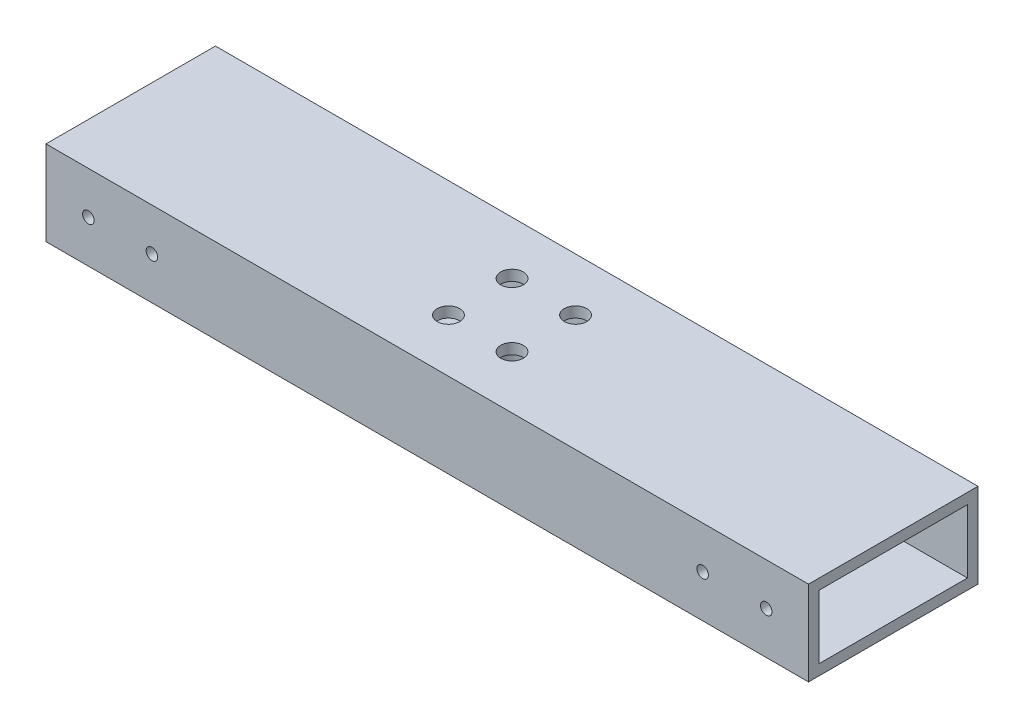
ISO-10303-21;
HEADER;
FILE_DESCRIPTION(('STEP AP214'),'2;1');
FILE_NAME('part.step','',(''),(''),'','','');
FILE_SCHEMA(('AUTOMOTIVE_DESIGN { 1 0 10303 214 1 1 1 1 }'));
ENDSEC;
DATA;
#1=APPLICATION_CONTEXT('core data for automotive mechanical design processes');
#2=APPLICATION_PROTOCOL_DEFINITION('international standard','automotive_design',2000,#1);
#3=PRODUCT_CONTEXT('',#1,'mechanical');
#4=PRODUCT('Part','Part','',(#3));
#5=PRODUCT_RELATED_PRODUCT_CATEGORY('part','',(#4));
#6=PRODUCT_DEFINITION_FORMATION('','',#4);
#7=PRODUCT_DEFINITION_CONTEXT('part definition',#1,'design');
#8=PRODUCT_DEFINITION('design','',#6,#7);
#9=PRODUCT_DEFINITION_SHAPE('','',#8);
#10=(LENGTH_UNIT() NAMED_UNIT(*) SI_UNIT(.MILLI.,.METRE.));
#11=(NAMED_UNIT(*) PLANE_ANGLE_UNIT() SI_UNIT($,.RADIAN.));
#12=(NAMED_UNIT(*) SI_UNIT($,.STERADIAN.) SOLID_ANGLE_UNIT());
#13=UNCERTAINTY_MEASURE_WITH_UNIT(LENGTH_MEASURE(1.E-05),#10,'distance_accuracy_value','');
#14=(GEOMETRIC_REPRESENTATION_CONTEXT(3) GLOBAL_UNCERTAINTY_ASSIGNED_CONTEXT((#13)) GLOBAL_UNIT_ASSIGNED_CONTEXT((#10,
#11,#12)) REPRESENTATION_CONTEXT('',''));
#15=CARTESIAN_POINT('',(0.,0.,0.));
#16=DIRECTION('',(0.,0.,1.));
#17=DIRECTION('',(1.,0.,0.));
#18=AXIS2_PLACEMENT_3D('',#15,#16,#17);
#19=CARTESIAN_POINT('',(114.3,0.,25.4));
#20=DIRECTION('',(0.,-1.,0.));
#21=DIRECTION('',(1.,0.,0.));
#22=AXIS2_PLACEMENT_3D('',#19,#20,#21);
#23=PLANE('',#22);
#24=CARTESIAN_POINT('',(9.525,0.,-9.525));
#25=DIRECTION('',(0.,1.,0.));
#26=DIRECTION('',(0.,0.,1.));
#27=AXIS2_PLACEMENT_3D('',#24,#25,#26);
#28=CIRCLE('',#27,3.37819999999999);
#29=CARTESIAN_POINT('',(9.525,0.,-6.14680000000001));
#30=VERTEX_POINT('',#29);
#31=EDGE_CURVE('E577',#30,#30,#28,.T.);
#32=ORIENTED_EDGE('',*,*,#31,.F.);
#33=EDGE_LOOP('',(#32));
#34=FACE_BOUND('',#33,.T.);
#35=CARTESIAN_POINT('',(9.525,0.,9.525));
#36=DIRECTION('',(0.,1.,0.));
#37=DIRECTION('',(0.,0.,1.));
#38=AXIS2_PLACEMENT_3D('',#35,#36,#37);
#39=CIRCLE('',#38,3.37819999999999);
#40=CARTESIAN_POINT('',(9.525,0.,12.9032));
#41=VERTEX_POINT('',#40);
#42=EDGE_CURVE('E583',#41,#41,#39,.T.);
#43=ORIENTED_EDGE('',*,*,#42,.F.);
#44=EDGE_LOOP('',(#43));
#45=FACE_BOUND('',#44,.T.);
#46=CARTESIAN_POINT('',(-9.525,0.,9.525));
#47=DIRECTION('',(0.,1.,0.));
#48=DIRECTION('',(0.,0.,1.));
#49=AXIS2_PLACEMENT_3D('',#46,#47,#48);
#50=CIRCLE('',#49,3.37819999999999);
#51=CARTESIAN_POINT('',(-9.525,0.,12.9032));
#52=VERTEX_POINT('',#51);
#53=EDGE_CURVE('E588',#52,#52,#50,.T.);
#54=ORIENTED_EDGE('',*,*,#53,.F.);
#55=EDGE_LOOP('',(#54));
#56=FACE_BOUND('',#55,.T.);
#57=DIRECTION('',(-1.,0.,0.));
#58=VECTOR('',#57,1.);
#59=CARTESIAN_POINT('',(114.3,0.,25.4));
#60=LINE('',#59,#58);
#61=CARTESIAN_POINT('',(114.3,0.,25.4));
#62=VERTEX_POINT('',#61);
#63=CARTESIAN_POINT('',(-114.3,0.,25.4));
#64=VERTEX_POINT('',#63);
#65=EDGE_CURVE('E124',#62,#64,#60,.T.);
#66=ORIENTED_EDGE('',*,*,#65,.F.);
#67=DIRECTION('',(0.,0.,-1.));
#68=VECTOR('',#67,1.);
#69=CARTESIAN_POINT('',(114.3,0.,25.4));
#70=LINE('',#69,#68);
#71=CARTESIAN_POINT('',(114.3,0.,-25.4));
#72=VERTEX_POINT('',#71);
#73=EDGE_CURVE('E106',#62,#72,#70,.T.);
#74=ORIENTED_EDGE('',*,*,#73,.T.);
#75=DIRECTION('',(-1.,0.,0.));
#76=VECTOR('',#75,1.);
#77=CARTESIAN_POINT('',(114.3,0.,-25.4));
#78=LINE('',#77,#76);
#79=CARTESIAN_POINT('',(-114.3,0.,-25.4));
#80=VERTEX_POINT('',#79);
#81=EDGE_CURVE('E138',#72,#80,#78,.T.);
#82=ORIENTED_EDGE('',*,*,#81,.T.);
#83=DIRECTION('',(0.,0.,1.));
#84=VECTOR('',#83,1.);
#85=CARTESIAN_POINT('',(-114.3,0.,25.4));
#86=LINE('',#85,#84);
#87=EDGE_CURVE('E118',#80,#64,#86,.T.);
#88=ORIENTED_EDGE('',*,*,#87,.T.);
#89=EDGE_LOOP('',(#66,#74,#82,#88));
#90=FACE_BOUND('',#89,.T.);
#91=CARTESIAN_POINT('',(-9.525,0.,-9.525));
#92=DIRECTION('',(0.,1.,0.));
#93=DIRECTION('',(0.,0.,1.));
#94=AXIS2_PLACEMENT_3D('',#91,#92,#93);
#95=CIRCLE('',#94,3.37819999999999);
#96=CARTESIAN_POINT('',(-9.525,0.,-6.14680000000001));
#97=VERTEX_POINT('',#96);
#98=EDGE_CURVE('E569',#97,#97,#95,.T.);
#99=ORIENTED_EDGE('',*,*,#98,.F.);
#100=EDGE_LOOP('',(#99));
#101=FACE_BOUND('',#100,.T.);
#102=ADVANCED_FACE('F35',(#34,#45,#56,#90,#101),#23,.F.);
#103=CARTESIAN_POINT('',(114.3,23.640442618558,-15.875));
#104=DIRECTION('',(-1.,0.,0.));
#105=DIRECTION('',(0.,-1.,0.));
#106=AXIS2_PLACEMENT_3D('',#103,#104,#105);
#107=PLANE('',#106);
#108=DIRECTION('',(0.,1.,0.));
#109=VECTOR('',#108,1.);
#110=CARTESIAN_POINT('',(114.3,-69.4961266284946,-25.4));
#111=LINE('',#110,#109);
#112=CARTESIAN_POINT('',(114.3,-25.4,-25.4));
#113=VERTEX_POINT('',#112);
#114=EDGE_CURVE('E113',#113,#72,#111,.T.);
#115=ORIENTED_EDGE('',*,*,#114,.T.);
#116=ORIENTED_EDGE('',*,*,#73,.F.);
#117=DIRECTION('',(0.,-1.,0.));
#118=VECTOR('',#117,1.);
#119=CARTESIAN_POINT('',(114.3,-69.4961266284946,25.4));
#120=LINE('',#119,#118);
#121=CARTESIAN_POINT('',(114.3,-25.4,25.4));
#122=VERTEX_POINT('',#121);
#123=EDGE_CURVE('E110',#62,#122,#120,.T.);
#124=ORIENTED_EDGE('',*,*,#123,.T.);
#125=DIRECTION('',(0.,0.,1.));
#126=VECTOR('',#125,1.);
#127=CARTESIAN_POINT('',(114.3,-25.4,25.4));
#128=LINE('',#127,#126);
#129=EDGE_CURVE('E187',#113,#122,#128,.T.);
#130=ORIENTED_EDGE('',*,*,#129,.F.);
#131=EDGE_LOOP('',(#115,#116,#124,#130));
#132=FACE_BOUND('',#131,.T.);
#133=DIRECTION('',(0.,0.,1.));
#134=VECTOR('',#133,1.);
#135=CARTESIAN_POINT('',(114.3,-22.2249999999999,22.225));
#136=LINE('',#135,#134);
#137=CARTESIAN_POINT('',(114.3,-22.2249999999999,-22.225));
#138=VERTEX_POINT('',#137);
#139=CARTESIAN_POINT('',(114.3,-22.2249999999999,22.225));
#140=VERTEX_POINT('',#139);
#141=EDGE_CURVE('E195',#138,#140,#136,.T.);
#142=ORIENTED_EDGE('',*,*,#141,.T.);
#143=DIRECTION('',(0.,-1.,0.));
#144=VECTOR('',#143,1.);
#145=CARTESIAN_POINT('',(114.3,-69.4961266284946,22.225));
#146=LINE('',#145,#144);
#147=CARTESIAN_POINT('',(114.3,-3.1749999999999,22.225));
#148=VERTEX_POINT('',#147);
#149=EDGE_CURVE('E52',#148,#140,#146,.T.);
#150=ORIENTED_EDGE('',*,*,#149,.F.);
#151=DIRECTION('',(0.,0.,-1.));
#152=VECTOR('',#151,1.);
#153=CARTESIAN_POINT('',(114.3,-3.17499999999996,22.225));
#154=LINE('',#153,#152);
#155=CARTESIAN_POINT('',(114.3,-3.1749999999999,-22.225));
#156=VERTEX_POINT('',#155);
#157=EDGE_CURVE('E191',#148,#156,#154,.T.);
#158=ORIENTED_EDGE('',*,*,#157,.T.);
#159=DIRECTION('',(0.,1.,0.));
#160=VECTOR('',#159,1.);
#161=CARTESIAN_POINT('',(114.3,-69.4961266284946,-22.225));
#162=LINE('',#161,#160);
#163=EDGE_CURVE('E184',#138,#156,#162,.T.);
#164=ORIENTED_EDGE('',*,*,#163,.F.);
#165=EDGE_LOOP('',(#142,#150,#158,#164));
#166=FACE_BOUND('',#165,.T.);
#167=ADVANCED_FACE('F108',(#132,#166),#107,.F.);
#168=CARTESIAN_POINT('',(-114.3,0.,5.38726575011048));
#169=DIRECTION('',(1.,0.,0.));
#170=DIRECTION('',(0.,1.,0.));
#171=AXIS2_PLACEMENT_3D('',#168,#169,#170);
#172=PLANE('',#171);
#173=DIRECTION('',(0.,0.,1.));
#174=VECTOR('',#173,1.);
#175=CARTESIAN_POINT('',(-114.3,-3.175,22.225));
#176=LINE('',#175,#174);
#177=CARTESIAN_POINT('',(-114.3,-3.17499999999994,-22.225));
#178=VERTEX_POINT('',#177);
#179=CARTESIAN_POINT('',(-114.3,-3.17499999999994,22.225));
#180=VERTEX_POINT('',#179);
#181=EDGE_CURVE('E194',#178,#180,#176,.T.);
#182=ORIENTED_EDGE('',*,*,#181,.T.);
#183=DIRECTION('',(0.,1.,0.));
#184=VECTOR('',#183,1.);
#185=CARTESIAN_POINT('',(-114.3,-69.4961266284946,22.225));
#186=LINE('',#185,#184);
#187=CARTESIAN_POINT('',(-114.3,-22.225,22.225));
#188=VERTEX_POINT('',#187);
#189=EDGE_CURVE('E182',#188,#180,#186,.T.);
#190=ORIENTED_EDGE('',*,*,#189,.F.);
#191=DIRECTION('',(0.,0.,-1.));
#192=VECTOR('',#191,1.);
#193=CARTESIAN_POINT('',(-114.3,-22.225,22.225));
#194=LINE('',#193,#192);
#195=CARTESIAN_POINT('',(-114.3,-22.225,-22.225));
#196=VERTEX_POINT('',#195);
#197=EDGE_CURVE('E60',#188,#196,#194,.T.);
#198=ORIENTED_EDGE('',*,*,#197,.T.);
#199=DIRECTION('',(0.,-1.,0.));
#200=VECTOR('',#199,1.);
#201=CARTESIAN_POINT('',(-114.3,-69.4961266284946,-22.225));
#202=LINE('',#201,#200);
#203=EDGE_CURVE('E183',#178,#196,#202,.T.);
#204=ORIENTED_EDGE('',*,*,#203,.F.);
#205=EDGE_LOOP('',(#182,#190,#198,#204));
#206=FACE_BOUND('',#205,.T.);
#207=ORIENTED_EDGE('',*,*,#87,.F.);
#208=DIRECTION('',(0.,-1.,0.));
#209=VECTOR('',#208,1.);
#210=CARTESIAN_POINT('',(-114.3,-69.4961266284946,-25.4));
#211=LINE('',#210,#209);
#212=CARTESIAN_POINT('',(-114.3,-25.4,-25.4));
#213=VERTEX_POINT('',#212);
#214=EDGE_CURVE('E190',#80,#213,#211,.T.);
#215=ORIENTED_EDGE('',*,*,#214,.T.);
#216=DIRECTION('',(0.,0.,-1.));
#217=VECTOR('',#216,1.);
#218=CARTESIAN_POINT('',(-114.3,-25.4,25.4));
#219=LINE('',#218,#217);
#220=CARTESIAN_POINT('',(-114.3,-25.4,25.4));
#221=VERTEX_POINT('',#220);
#222=EDGE_CURVE('E186',#221,#213,#219,.T.);
#223=ORIENTED_EDGE('',*,*,#222,.F.);
#224=DIRECTION('',(0.,1.,0.));
#225=VECTOR('',#224,1.);
#226=CARTESIAN_POINT('',(-114.3,-69.4961266284946,25.4));
#227=LINE('',#226,#225);
#228=EDGE_CURVE('E39',#221,#64,#227,.T.);
#229=ORIENTED_EDGE('',*,*,#228,.T.);
#230=EDGE_LOOP('',(#207,#215,#223,#229));
#231=FACE_BOUND('',#230,.T.);
#232=ADVANCED_FACE('F213',(#206,#231),#172,.F.);
#233=CARTESIAN_POINT('',(139.7,-69.4961266284946,-25.4));
#234=DIRECTION('',(0.,0.,-1.));
#235=DIRECTION('',(-1.,0.,0.));
#236=AXIS2_PLACEMENT_3D('',#233,#234,#235);
#237=PLANE('',#236);
#238=ORIENTED_EDGE('',*,*,#114,.F.);
#239=DIRECTION('',(-1.,0.,0.));
#240=VECTOR('',#239,1.);
#241=CARTESIAN_POINT('',(139.7,-25.4,-25.4));
#242=LINE('',#241,#240);
#243=EDGE_CURVE('E135',#113,#213,#242,.T.);
#244=ORIENTED_EDGE('',*,*,#243,.T.);
#245=ORIENTED_EDGE('',*,*,#214,.F.);
#246=ORIENTED_EDGE('',*,*,#81,.F.);
#247=EDGE_LOOP('',(#238,#244,#245,#246));
#248=FACE_BOUND('',#247,.T.);
#249=CARTESIAN_POINT('',(-101.6,-12.7000000000001,-25.4));
#250=DIRECTION('',(0.,0.,1.));
#251=DIRECTION('',(1.,0.,0.));
#252=AXIS2_PLACEMENT_3D('',#249,#250,#251);
#253=CIRCLE('',#252,1.7272);
#254=CARTESIAN_POINT('',(-99.8728,-12.7000000000001,-25.4));
#255=VERTEX_POINT('',#254);
#256=EDGE_CURVE('E167',#255,#255,#253,.T.);
#257=ORIENTED_EDGE('',*,*,#256,.T.);
#258=EDGE_LOOP('',(#257));
#259=FACE_BOUND('',#258,.T.);
#260=CARTESIAN_POINT('',(82.55,-12.7000000000003,-25.4));
#261=DIRECTION('',(0.,0.,1.));
#262=DIRECTION('',(1.,0.,0.));
#263=AXIS2_PLACEMENT_3D('',#260,#261,#262);
#264=CIRCLE('',#263,1.7272);
#265=CARTESIAN_POINT('',(84.2772,-12.7000000000003,-25.4));
#266=VERTEX_POINT('',#265);
#267=EDGE_CURVE('E155',#266,#266,#264,.T.);
#268=ORIENTED_EDGE('',*,*,#267,.T.);
#269=EDGE_LOOP('',(#268));
#270=FACE_BOUND('',#269,.T.);
#271=CARTESIAN_POINT('',(101.6,-12.7000000000001,-25.4));
#272=DIRECTION('',(0.,0.,1.));
#273=DIRECTION('',(1.,0.,0.));
#274=AXIS2_PLACEMENT_3D('',#271,#272,#273);
#275=CIRCLE('',#274,1.7272);
#276=CARTESIAN_POINT('',(103.3272,-12.7000000000001,-25.4));
#277=VERTEX_POINT('',#276);
#278=EDGE_CURVE('E143',#277,#277,#275,.T.);
#279=ORIENTED_EDGE('',*,*,#278,.T.);
#280=EDGE_LOOP('',(#279));
#281=FACE_BOUND('',#280,.T.);
#282=CARTESIAN_POINT('',(-82.55,-12.7000000000003,-25.4));
#283=DIRECTION('',(0.,0.,1.));
#284=DIRECTION('',(1.,0.,0.));
#285=AXIS2_PLACEMENT_3D('',#282,#283,#284);
#286=CIRCLE('',#285,1.7272);
#287=CARTESIAN_POINT('',(-80.8228,-12.7000000000003,-25.4));
#288=VERTEX_POINT('',#287);
#289=EDGE_CURVE('E44',#288,#288,#286,.T.);
#290=ORIENTED_EDGE('',*,*,#289,.T.);
#291=EDGE_LOOP('',(#290));
#292=FACE_BOUND('',#291,.T.);
#293=ADVANCED_FACE('F37',(#248,#259,#270,#281,#292),#237,.T.);
#294=CARTESIAN_POINT('',(139.7,-25.3999999999999,25.4));
#295=DIRECTION('',(0.,1.,0.));
#296=DIRECTION('',(-1.,0.,0.));
#297=AXIS2_PLACEMENT_3D('',#294,#295,#296);
#298=PLANE('',#297);
#299=CARTESIAN_POINT('',(-9.525,-25.4,-9.525));
#300=DIRECTION('',(0.,-1.,0.));
#301=DIRECTION('',(1.,0.,0.));
#302=AXIS2_PLACEMENT_3D('',#299,#300,#301);
#303=CIRCLE('',#302,5.55625);
#304=CARTESIAN_POINT('',(-3.96875,-25.4,-9.525));
#305=VERTEX_POINT('',#304);
#306=EDGE_CURVE('E549',#305,#305,#303,.T.);
#307=ORIENTED_EDGE('',*,*,#306,.F.);
#308=EDGE_LOOP('',(#307));
#309=FACE_BOUND('',#308,.T.);
#310=CARTESIAN_POINT('',(9.52500000000001,-25.4,-9.525));
#311=DIRECTION('',(0.,-1.,0.));
#312=DIRECTION('',(1.,0.,0.));
#313=AXIS2_PLACEMENT_3D('',#310,#311,#312);
#314=CIRCLE('',#313,5.55625);
#315=CARTESIAN_POINT('',(15.08125,-25.4,-9.525));
#316=VERTEX_POINT('',#315);
#317=EDGE_CURVE('E553',#316,#316,#314,.T.);
#318=ORIENTED_EDGE('',*,*,#317,.F.);
#319=EDGE_LOOP('',(#318));
#320=FACE_BOUND('',#319,.T.);
#321=CARTESIAN_POINT('',(9.52500000000001,-25.4,9.525));
#322=DIRECTION('',(0.,-1.,0.));
#323=DIRECTION('',(1.,0.,0.));
#324=AXIS2_PLACEMENT_3D('',#321,#322,#323);
#325=CIRCLE('',#324,5.55625);
#326=CARTESIAN_POINT('',(15.08125,-25.4,9.525));
#327=VERTEX_POINT('',#326);
#328=EDGE_CURVE('E560',#327,#327,#325,.T.);
#329=ORIENTED_EDGE('',*,*,#328,.F.);
#330=EDGE_LOOP('',(#329));
#331=FACE_BOUND('',#330,.T.);
#332=CARTESIAN_POINT('',(-9.525,-25.4,9.525));
#333=DIRECTION('',(0.,-1.,0.));
#334=DIRECTION('',(1.,0.,0.));
#335=AXIS2_PLACEMENT_3D('',#332,#333,#334);
#336=CIRCLE('',#335,5.55625);
#337=CARTESIAN_POINT('',(-3.96875,-25.4,9.525));
#338=VERTEX_POINT('',#337);
#339=EDGE_CURVE('E566',#338,#338,#336,.T.);
#340=ORIENTED_EDGE('',*,*,#339,.F.);
#341=EDGE_LOOP('',(#340));
#342=FACE_BOUND('',#341,.T.);
#343=ORIENTED_EDGE('',*,*,#243,.F.);
#344=ORIENTED_EDGE('',*,*,#129,.T.);
#345=DIRECTION('',(-1.,0.,0.));
#346=VECTOR('',#345,1.);
#347=CARTESIAN_POINT('',(139.7,-25.3999999999999,25.4));
#348=LINE('',#347,#346);
#349=EDGE_CURVE('E126',#122,#221,#348,.T.);
#350=ORIENTED_EDGE('',*,*,#349,.T.);
#351=ORIENTED_EDGE('',*,*,#222,.T.);
#352=EDGE_LOOP('',(#343,#344,#350,#351));
#353=FACE_BOUND('',#352,.T.);
#354=ADVANCED_FACE('F231',(#309,#320,#331,#342,#353),#298,.F.);
#355=CARTESIAN_POINT('',(117.475,-3.17499999999996,22.225));
#356=DIRECTION('',(0.,-1.,0.));
#357=DIRECTION('',(1.,0.,0.));
#358=AXIS2_PLACEMENT_3D('',#355,#356,#357);
#359=PLANE('',#358);
#360=CARTESIAN_POINT('',(-9.525,-3.17499999999998,-9.525));
#361=DIRECTION('',(0.,-1.,0.));
#362=DIRECTION('',(1.,0.,0.));
#363=AXIS2_PLACEMENT_3D('',#360,#361,#362);
#364=CIRCLE('',#363,3.37819999999999);
#365=CARTESIAN_POINT('',(-6.14680000000001,-3.17499999999998,-9.525));
#366=VERTEX_POINT('',#365);
#367=EDGE_CURVE('E574',#366,#366,#364,.T.);
#368=ORIENTED_EDGE('',*,*,#367,.F.);
#369=EDGE_LOOP('',(#368));
#370=FACE_BOUND('',#369,.T.);
#371=CARTESIAN_POINT('',(9.525,-3.17499999999998,-9.525));
#372=DIRECTION('',(0.,-1.,0.));
#373=DIRECTION('',(1.,0.,0.));
#374=AXIS2_PLACEMENT_3D('',#371,#372,#373);
#375=CIRCLE('',#374,3.37819999999999);
#376=CARTESIAN_POINT('',(12.9032,-3.17499999999997,-9.525));
#377=VERTEX_POINT('',#376);
#378=EDGE_CURVE('E580',#377,#377,#375,.T.);
#379=ORIENTED_EDGE('',*,*,#378,.F.);
#380=EDGE_LOOP('',(#379));
#381=FACE_BOUND('',#380,.T.);
#382=CARTESIAN_POINT('',(9.525,-3.17499999999998,9.525));
#383=DIRECTION('',(0.,-1.,0.));
#384=DIRECTION('',(1.,0.,0.));
#385=AXIS2_PLACEMENT_3D('',#382,#383,#384);
#386=CIRCLE('',#385,3.37819999999999);
#387=CARTESIAN_POINT('',(12.9032,-3.17499999999997,9.525));
#388=VERTEX_POINT('',#387);
#389=EDGE_CURVE('E586',#388,#388,#386,.T.);
#390=ORIENTED_EDGE('',*,*,#389,.F.);
#391=EDGE_LOOP('',(#390));
#392=FACE_BOUND('',#391,.T.);
#393=CARTESIAN_POINT('',(-9.525,-3.17499999999998,9.525));
#394=DIRECTION('',(0.,-1.,0.));
#395=DIRECTION('',(1.,0.,0.));
#396=AXIS2_PLACEMENT_3D('',#393,#394,#395);
#397=CIRCLE('',#396,3.37819999999999);
#398=CARTESIAN_POINT('',(-6.14680000000001,-3.17499999999998,9.525));
#399=VERTEX_POINT('',#398);
#400=EDGE_CURVE('E225',#399,#399,#397,.T.);
#401=ORIENTED_EDGE('',*,*,#400,.F.);
#402=EDGE_LOOP('',(#401));
#403=FACE_BOUND('',#402,.T.);
#404=ORIENTED_EDGE('',*,*,#157,.F.);
#405=DIRECTION('',(-1.,0.,0.));
#406=VECTOR('',#405,1.);
#407=CARTESIAN_POINT('',(117.475,-3.1749999999999,22.225));
#408=LINE('',#407,#406);
#409=EDGE_CURVE('E206',#148,#180,#408,.T.);
#410=ORIENTED_EDGE('',*,*,#409,.T.);
#411=ORIENTED_EDGE('',*,*,#181,.F.);
#412=DIRECTION('',(-1.,0.,0.));
#413=VECTOR('',#412,1.);
#414=CARTESIAN_POINT('',(117.475,-3.1749999999999,-22.225));
#415=LINE('',#414,#413);
#416=EDGE_CURVE('E199',#156,#178,#415,.T.);
#417=ORIENTED_EDGE('',*,*,#416,.F.);
#418=EDGE_LOOP('',(#404,#410,#411,#417));
#419=FACE_BOUND('',#418,.T.);
#420=ADVANCED_FACE('F291',(#370,#381,#392,#403,#419),#359,.T.);
#421=CARTESIAN_POINT('',(136.525,-22.2249999999999,22.225));
#422=DIRECTION('',(0.,1.,0.));
#423=DIRECTION('',(-1.,0.,0.));
#424=AXIS2_PLACEMENT_3D('',#421,#422,#423);
#425=PLANE('',#424);
#426=CARTESIAN_POINT('',(-9.525,-22.225,-9.525));
#427=DIRECTION('',(0.,1.,0.));
#428=DIRECTION('',(-1.,0.,0.));
#429=AXIS2_PLACEMENT_3D('',#426,#427,#428);
#430=CIRCLE('',#429,5.55625);
#431=CARTESIAN_POINT('',(-15.08125,-22.225,-9.525));
#432=VERTEX_POINT('',#431);
#433=EDGE_CURVE('E546',#432,#432,#430,.F.);
#434=ORIENTED_EDGE('',*,*,#433,.T.);
#435=EDGE_LOOP('',(#434));
#436=FACE_BOUND('',#435,.T.);
#437=CARTESIAN_POINT('',(9.525,-22.225,-9.525));
#438=DIRECTION('',(0.,1.,0.));
#439=DIRECTION('',(-1.,0.,0.));
#440=AXIS2_PLACEMENT_3D('',#437,#438,#439);
#441=CIRCLE('',#440,5.55625);
#442=CARTESIAN_POINT('',(3.96875,-22.225,-9.525));
#443=VERTEX_POINT('',#442);
#444=EDGE_CURVE('E550',#443,#443,#441,.F.);
#445=ORIENTED_EDGE('',*,*,#444,.T.);
#446=EDGE_LOOP('',(#445));
#447=FACE_BOUND('',#446,.T.);
#448=CARTESIAN_POINT('',(9.525,-22.225,9.525));
#449=DIRECTION('',(0.,1.,0.));
#450=DIRECTION('',(-1.,0.,0.));
#451=AXIS2_PLACEMENT_3D('',#448,#449,#450);
#452=CIRCLE('',#451,5.55625);
#453=CARTESIAN_POINT('',(3.96875,-22.225,9.525));
#454=VERTEX_POINT('',#453);
#455=EDGE_CURVE('E558',#454,#454,#452,.F.);
#456=ORIENTED_EDGE('',*,*,#455,.T.);
#457=EDGE_LOOP('',(#456));
#458=FACE_BOUND('',#457,.T.);
#459=CARTESIAN_POINT('',(-9.525,-22.225,9.525));
#460=DIRECTION('',(0.,1.,0.));
#461=DIRECTION('',(-1.,0.,0.));
#462=AXIS2_PLACEMENT_3D('',#459,#460,#461);
#463=CIRCLE('',#462,5.55625);
#464=CARTESIAN_POINT('',(-15.08125,-22.225,9.525));
#465=VERTEX_POINT('',#464);
#466=EDGE_CURVE('E563',#465,#465,#463,.F.);
#467=ORIENTED_EDGE('',*,*,#466,.T.);
#468=EDGE_LOOP('',(#467));
#469=FACE_BOUND('',#468,.T.);
#470=ORIENTED_EDGE('',*,*,#141,.F.);
#471=DIRECTION('',(-1.,0.,0.));
#472=VECTOR('',#471,1.);
#473=CARTESIAN_POINT('',(136.525,-22.2249999999999,-22.225));
#474=LINE('',#473,#472);
#475=EDGE_CURVE('E202',#138,#196,#474,.T.);
#476=ORIENTED_EDGE('',*,*,#475,.T.);
#477=ORIENTED_EDGE('',*,*,#197,.F.);
#478=DIRECTION('',(-1.,0.,0.));
#479=VECTOR('',#478,1.);
#480=CARTESIAN_POINT('',(136.525,-22.2249999999999,22.225));
#481=LINE('',#480,#479);
#482=EDGE_CURVE('E204',#140,#188,#481,.T.);
#483=ORIENTED_EDGE('',*,*,#482,.F.);
#484=EDGE_LOOP('',(#470,#476,#477,#483));
#485=FACE_BOUND('',#484,.T.);
#486=ADVANCED_FACE('F218',(#436,#447,#458,#469,#485),#425,.T.);
#487=CARTESIAN_POINT('',(136.525,-69.4961266284946,-22.225));
#488=DIRECTION('',(0.,0.,-1.));
#489=DIRECTION('',(-1.,0.,0.));
#490=AXIS2_PLACEMENT_3D('',#487,#488,#489);
#491=PLANE('',#490);
#492=CARTESIAN_POINT('',(-82.55,-12.7000000000003,-22.225));
#493=DIRECTION('',(0.,0.,-1.));
#494=DIRECTION('',(-1.,0.,0.));
#495=AXIS2_PLACEMENT_3D('',#492,#493,#494);
#496=CIRCLE('',#495,1.72719999999999);
#497=CARTESIAN_POINT('',(-84.2772,-12.7000000000003,-22.225));
#498=VERTEX_POINT('',#497);
#499=EDGE_CURVE('E173',#498,#498,#496,.T.);
#500=ORIENTED_EDGE('',*,*,#499,.T.);
#501=EDGE_LOOP('',(#500));
#502=FACE_BOUND('',#501,.T.);
#503=CARTESIAN_POINT('',(-101.6,-12.7000000000001,-22.225));
#504=DIRECTION('',(0.,0.,-1.));
#505=DIRECTION('',(-1.,0.,0.));
#506=AXIS2_PLACEMENT_3D('',#503,#504,#505);
#507=CIRCLE('',#506,1.72719999999999);
#508=CARTESIAN_POINT('',(-103.3272,-12.7000000000001,-22.225));
#509=VERTEX_POINT('',#508);
#510=EDGE_CURVE('E164',#509,#509,#507,.T.);
#511=ORIENTED_EDGE('',*,*,#510,.T.);
#512=EDGE_LOOP('',(#511));
#513=FACE_BOUND('',#512,.T.);
#514=CARTESIAN_POINT('',(82.55,-12.7000000000003,-22.225));
#515=DIRECTION('',(0.,0.,-1.));
#516=DIRECTION('',(-1.,0.,0.));
#517=AXIS2_PLACEMENT_3D('',#514,#515,#516);
#518=CIRCLE('',#517,1.72719999999999);
#519=CARTESIAN_POINT('',(80.8228,-12.7000000000003,-22.225));
#520=VERTEX_POINT('',#519);
#521=EDGE_CURVE('E149',#520,#520,#518,.T.);
#522=ORIENTED_EDGE('',*,*,#521,.T.);
#523=EDGE_LOOP('',(#522));
#524=FACE_BOUND('',#523,.T.);
#525=CARTESIAN_POINT('',(101.6,-12.7000000000001,-22.225));
#526=DIRECTION('',(0.,0.,-1.));
#527=DIRECTION('',(-1.,0.,0.));
#528=AXIS2_PLACEMENT_3D('',#525,#526,#527);
#529=CIRCLE('',#528,1.72719999999999);
#530=CARTESIAN_POINT('',(99.8728,-12.7000000000001,-22.225));
#531=VERTEX_POINT('',#530);
#532=EDGE_CURVE('E130',#531,#531,#529,.T.);
#533=ORIENTED_EDGE('',*,*,#532,.T.);
#534=EDGE_LOOP('',(#533));
#535=FACE_BOUND('',#534,.T.);
#536=ORIENTED_EDGE('',*,*,#475,.F.);
#537=ORIENTED_EDGE('',*,*,#163,.T.);
#538=ORIENTED_EDGE('',*,*,#416,.T.);
#539=ORIENTED_EDGE('',*,*,#203,.T.);
#540=EDGE_LOOP('',(#536,#537,#538,#539));
#541=FACE_BOUND('',#540,.T.);
#542=ADVANCED_FACE('F220',(#502,#513,#524,#535,#541),#491,.F.);
#543=CARTESIAN_POINT('',(136.525,-69.4961266284946,22.225));
#544=DIRECTION('',(0.,0.,1.));
#545=DIRECTION('',(1.,0.,0.));
#546=AXIS2_PLACEMENT_3D('',#543,#544,#545);
#547=PLANE('',#546);
#548=CARTESIAN_POINT('',(-82.55,-12.7000000000003,22.225));
#549=DIRECTION('',(0.,0.,1.));
#550=DIRECTION('',(1.,0.,0.));
#551=AXIS2_PLACEMENT_3D('',#548,#549,#550);
#552=CIRCLE('',#551,1.72719999999999);
#553=CARTESIAN_POINT('',(-80.8228,-12.7000000000003,22.225));
#554=VERTEX_POINT('',#553);
#555=EDGE_CURVE('E176',#554,#554,#552,.T.);
#556=ORIENTED_EDGE('',*,*,#555,.T.);
#557=EDGE_LOOP('',(#556));
#558=FACE_BOUND('',#557,.T.);
#559=CARTESIAN_POINT('',(-101.6,-12.7000000000001,22.225));
#560=DIRECTION('',(0.,0.,1.));
#561=DIRECTION('',(1.,0.,0.));
#562=AXIS2_PLACEMENT_3D('',#559,#560,#561);
#563=CIRCLE('',#562,1.72719999999999);
#564=CARTESIAN_POINT('',(-99.8728,-12.7000000000001,22.225));
#565=VERTEX_POINT('',#564);
#566=EDGE_CURVE('E161',#565,#565,#563,.T.);
#567=ORIENTED_EDGE('',*,*,#566,.T.);
#568=EDGE_LOOP('',(#567));
#569=FACE_BOUND('',#568,.T.);
#570=CARTESIAN_POINT('',(82.55,-12.7000000000003,22.225));
#571=DIRECTION('',(0.,0.,1.));
#572=DIRECTION('',(1.,0.,0.));
#573=AXIS2_PLACEMENT_3D('',#570,#571,#572);
#574=CIRCLE('',#573,1.72719999999999);
#575=CARTESIAN_POINT('',(84.2772,-12.7000000000003,22.225));
#576=VERTEX_POINT('',#575);
#577=EDGE_CURVE('E152',#576,#576,#574,.T.);
#578=ORIENTED_EDGE('',*,*,#577,.T.);
#579=EDGE_LOOP('',(#578));
#580=FACE_BOUND('',#579,.T.);
#581=CARTESIAN_POINT('',(101.6,-12.7000000000001,22.225));
#582=DIRECTION('',(0.,0.,1.));
#583=DIRECTION('',(1.,0.,0.));
#584=AXIS2_PLACEMENT_3D('',#581,#582,#583);
#585=CIRCLE('',#584,1.72719999999999);
#586=CARTESIAN_POINT('',(103.3272,-12.7000000000001,22.225));
#587=VERTEX_POINT('',#586);
#588=EDGE_CURVE('E133',#587,#587,#585,.T.);
#589=ORIENTED_EDGE('',*,*,#588,.T.);
#590=EDGE_LOOP('',(#589));
#591=FACE_BOUND('',#590,.T.);
#592=ORIENTED_EDGE('',*,*,#409,.F.);
#593=ORIENTED_EDGE('',*,*,#149,.T.);
#594=ORIENTED_EDGE('',*,*,#482,.T.);
#595=ORIENTED_EDGE('',*,*,#189,.T.);
#596=EDGE_LOOP('',(#592,#593,#594,#595));
#597=FACE_BOUND('',#596,.T.);
#598=ADVANCED_FACE('F254',(#558,#569,#580,#591,#597),#547,.F.);
#599=CARTESIAN_POINT('',(139.7,-69.4961266284946,25.4));
#600=DIRECTION('',(0.,0.,1.));
#601=DIRECTION('',(1.,0.,0.));
#602=AXIS2_PLACEMENT_3D('',#599,#600,#601);
#603=PLANE('',#602);
#604=ORIENTED_EDGE('',*,*,#123,.F.);
#605=ORIENTED_EDGE('',*,*,#65,.T.);
#606=ORIENTED_EDGE('',*,*,#228,.F.);
#607=ORIENTED_EDGE('',*,*,#349,.F.);
#608=EDGE_LOOP('',(#604,#605,#606,#607));
#609=FACE_BOUND('',#608,.T.);
#610=CARTESIAN_POINT('',(-82.55,-12.7000000000003,25.4));
#611=DIRECTION('',(0.,0.,1.));
#612=DIRECTION('',(1.,0.,0.));
#613=AXIS2_PLACEMENT_3D('',#610,#611,#612);
#614=CIRCLE('',#613,1.72719999999998);
#615=CARTESIAN_POINT('',(-80.8228,-12.7000000000003,25.4));
#616=VERTEX_POINT('',#615);
#617=EDGE_CURVE('E11',#616,#616,#614,.T.);
#618=ORIENTED_EDGE('',*,*,#617,.F.);
#619=EDGE_LOOP('',(#618));
#620=FACE_BOUND('',#619,.T.);
#621=CARTESIAN_POINT('',(-101.6,-12.7000000000001,25.4));
#622=DIRECTION('',(0.,0.,1.));
#623=DIRECTION('',(1.,0.,0.));
#624=AXIS2_PLACEMENT_3D('',#621,#622,#623);
#625=CIRCLE('',#624,1.72719999999998);
#626=CARTESIAN_POINT('',(-99.8728,-12.7000000000001,25.4));
#627=VERTEX_POINT('',#626);
#628=EDGE_CURVE('E170',#627,#627,#625,.T.);
#629=ORIENTED_EDGE('',*,*,#628,.F.);
#630=EDGE_LOOP('',(#629));
#631=FACE_BOUND('',#630,.T.);
#632=CARTESIAN_POINT('',(82.55,-12.7000000000003,25.4));
#633=DIRECTION('',(0.,0.,1.));
#634=DIRECTION('',(1.,0.,0.));
#635=AXIS2_PLACEMENT_3D('',#632,#633,#634);
#636=CIRCLE('',#635,1.72719999999998);
#637=CARTESIAN_POINT('',(84.2772,-12.7000000000003,25.4));
#638=VERTEX_POINT('',#637);
#639=EDGE_CURVE('E158',#638,#638,#636,.T.);
#640=ORIENTED_EDGE('',*,*,#639,.F.);
#641=EDGE_LOOP('',(#640));
#642=FACE_BOUND('',#641,.T.);
#643=CARTESIAN_POINT('',(101.6,-12.7000000000001,25.4));
#644=DIRECTION('',(0.,0.,1.));
#645=DIRECTION('',(1.,0.,0.));
#646=AXIS2_PLACEMENT_3D('',#643,#644,#645);
#647=CIRCLE('',#646,1.72719999999998);
#648=CARTESIAN_POINT('',(103.3272,-12.7000000000001,25.4));
#649=VERTEX_POINT('',#648);
#650=EDGE_CURVE('E146',#649,#649,#647,.T.);
#651=ORIENTED_EDGE('',*,*,#650,.F.);
#652=EDGE_LOOP('',(#651));
#653=FACE_BOUND('',#652,.T.);
#654=ADVANCED_FACE('F122',(#609,#620,#631,#642,#653),#603,.T.);
#655=CARTESIAN_POINT('',(101.6,-12.7000000000001,25.4));
#656=DIRECTION('',(0.,0.,1.));
#657=DIRECTION('',(1.,0.,0.));
#658=AXIS2_PLACEMENT_3D('',#655,#656,#657);
#659=CYLINDRICAL_SURFACE('',#658,1.72719999999999);
#660=ORIENTED_EDGE('',*,*,#650,.T.);
#661=EDGE_LOOP('',(#660));
#662=FACE_BOUND('',#661,.T.);
#663=ORIENTED_EDGE('',*,*,#588,.F.);
#664=EDGE_LOOP('',(#663));
#665=FACE_BOUND('',#664,.T.);
#666=ADVANCED_FACE('F265',(#662,#665),#659,.F.);
#667=ORIENTED_EDGE('',*,*,#278,.F.);
#668=EDGE_LOOP('',(#667));
#669=FACE_BOUND('',#668,.T.);
#670=ORIENTED_EDGE('',*,*,#532,.F.);
#671=EDGE_LOOP('',(#670));
#672=FACE_BOUND('',#671,.T.);
#673=ADVANCED_FACE('F262',(#669,#672),#659,.F.);
#674=CARTESIAN_POINT('',(82.55,-12.7000000000003,25.4));
#675=DIRECTION('',(0.,0.,1.));
#676=DIRECTION('',(1.,0.,0.));
#677=AXIS2_PLACEMENT_3D('',#674,#675,#676);
#678=CYLINDRICAL_SURFACE('',#677,1.72719999999999);
#679=ORIENTED_EDGE('',*,*,#639,.T.);
#680=EDGE_LOOP('',(#679));
#681=FACE_BOUND('',#680,.T.);
#682=ORIENTED_EDGE('',*,*,#577,.F.);
#683=EDGE_LOOP('',(#682));
#684=FACE_BOUND('',#683,.T.);
#685=ADVANCED_FACE('F264',(#681,#684),#678,.F.);
#686=ORIENTED_EDGE('',*,*,#267,.F.);
#687=EDGE_LOOP('',(#686));
#688=FACE_BOUND('',#687,.T.);
#689=ORIENTED_EDGE('',*,*,#521,.F.);
#690=EDGE_LOOP('',(#689));
#691=FACE_BOUND('',#690,.T.);
#692=ADVANCED_FACE('F272',(#688,#691),#678,.F.);
#693=CARTESIAN_POINT('',(-101.6,-12.7000000000001,25.4));
#694=DIRECTION('',(0.,0.,1.));
#695=DIRECTION('',(1.,0.,0.));
#696=AXIS2_PLACEMENT_3D('',#693,#694,#695);
#697=CYLINDRICAL_SURFACE('',#696,1.72719999999999);
#698=ORIENTED_EDGE('',*,*,#628,.T.);
#699=EDGE_LOOP('',(#698));
#700=FACE_BOUND('',#699,.T.);
#701=ORIENTED_EDGE('',*,*,#566,.F.);
#702=EDGE_LOOP('',(#701));
#703=FACE_BOUND('',#702,.T.);
#704=ADVANCED_FACE('F307',(#700,#703),#697,.F.);
#705=ORIENTED_EDGE('',*,*,#256,.F.);
#706=EDGE_LOOP('',(#705));
#707=FACE_BOUND('',#706,.T.);
#708=ORIENTED_EDGE('',*,*,#510,.F.);
#709=EDGE_LOOP('',(#708));
#710=FACE_BOUND('',#709,.T.);
#711=ADVANCED_FACE('F309',(#707,#710),#697,.F.);
#712=CARTESIAN_POINT('',(-82.55,-12.7000000000003,25.4));
#713=DIRECTION('',(0.,0.,1.));
#714=DIRECTION('',(1.,0.,0.));
#715=AXIS2_PLACEMENT_3D('',#712,#713,#714);
#716=CYLINDRICAL_SURFACE('',#715,1.72719999999999);
#717=ORIENTED_EDGE('',*,*,#617,.T.);
#718=EDGE_LOOP('',(#717));
#719=FACE_BOUND('',#718,.T.);
#720=ORIENTED_EDGE('',*,*,#555,.F.);
#721=EDGE_LOOP('',(#720));
#722=FACE_BOUND('',#721,.T.);
#723=ADVANCED_FACE('F248',(#719,#722),#716,.F.);
#724=ORIENTED_EDGE('',*,*,#289,.F.);
#725=EDGE_LOOP('',(#724));
#726=FACE_BOUND('',#725,.T.);
#727=ORIENTED_EDGE('',*,*,#499,.F.);
#728=EDGE_LOOP('',(#727));
#729=FACE_BOUND('',#728,.T.);
#730=ADVANCED_FACE('F245',(#726,#729),#716,.F.);
#731=CARTESIAN_POINT('',(-9.525,0.,9.525));
#732=DIRECTION('',(0.,1.,0.));
#733=DIRECTION('',(0.,0.,1.));
#734=AXIS2_PLACEMENT_3D('',#731,#732,#733);
#735=CYLINDRICAL_SURFACE('',#734,3.37819999999999);
#736=ORIENTED_EDGE('',*,*,#53,.T.);
#737=EDGE_LOOP('',(#736));
#738=FACE_BOUND('',#737,.T.);
#739=ORIENTED_EDGE('',*,*,#400,.T.);
#740=EDGE_LOOP('',(#739));
#741=FACE_BOUND('',#740,.T.);
#742=ADVANCED_FACE('F236',(#738,#741),#735,.F.);
#743=CARTESIAN_POINT('',(9.525,0.,9.525));
#744=DIRECTION('',(0.,1.,0.));
#745=DIRECTION('',(0.,0.,1.));
#746=AXIS2_PLACEMENT_3D('',#743,#744,#745);
#747=CYLINDRICAL_SURFACE('',#746,3.37819999999999);
#748=ORIENTED_EDGE('',*,*,#42,.T.);
#749=EDGE_LOOP('',(#748));
#750=FACE_BOUND('',#749,.T.);
#751=ORIENTED_EDGE('',*,*,#389,.T.);
#752=EDGE_LOOP('',(#751));
#753=FACE_BOUND('',#752,.T.);
#754=ADVANCED_FACE('F349',(#750,#753),#747,.F.);
#755=CARTESIAN_POINT('',(9.525,0.,-9.525));
#756=DIRECTION('',(0.,1.,0.));
#757=DIRECTION('',(0.,0.,1.));
#758=AXIS2_PLACEMENT_3D('',#755,#756,#757);
#759=CYLINDRICAL_SURFACE('',#758,3.37819999999999);
#760=ORIENTED_EDGE('',*,*,#31,.T.);
#761=EDGE_LOOP('',(#760));
#762=FACE_BOUND('',#761,.T.);
#763=ORIENTED_EDGE('',*,*,#378,.T.);
#764=EDGE_LOOP('',(#763));
#765=FACE_BOUND('',#764,.T.);
#766=ADVANCED_FACE('F356',(#762,#765),#759,.F.);
#767=CARTESIAN_POINT('',(-9.525,0.,-9.525));
#768=DIRECTION('',(0.,1.,0.));
#769=DIRECTION('',(0.,0.,1.));
#770=AXIS2_PLACEMENT_3D('',#767,#768,#769);
#771=CYLINDRICAL_SURFACE('',#770,3.37819999999999);
#772=ORIENTED_EDGE('',*,*,#98,.T.);
#773=EDGE_LOOP('',(#772));
#774=FACE_BOUND('',#773,.T.);
#775=ORIENTED_EDGE('',*,*,#367,.T.);
#776=EDGE_LOOP('',(#775));
#777=FACE_BOUND('',#776,.T.);
#778=ADVANCED_FACE('F364',(#774,#777),#771,.F.);
#779=CARTESIAN_POINT('',(-9.525,0.00100000000006345,9.525));
#780=DIRECTION('',(0.,-1.,0.));
#781=DIRECTION('',(1.,0.,0.));
#782=AXIS2_PLACEMENT_3D('',#779,#780,#781);
#783=CYLINDRICAL_SURFACE('',#782,5.55625);
#784=ORIENTED_EDGE('',*,*,#466,.F.);
#785=EDGE_LOOP('',(#784));
#786=FACE_BOUND('',#785,.T.);
#787=ORIENTED_EDGE('',*,*,#339,.T.);
#788=EDGE_LOOP('',(#787));
#789=FACE_BOUND('',#788,.T.);
#790=ADVANCED_FACE('F372',(#786,#789),#783,.F.);
#791=CARTESIAN_POINT('',(9.525,0.00100000000007039,9.525));
#792=DIRECTION('',(0.,-1.,0.));
#793=DIRECTION('',(1.,0.,0.));
#794=AXIS2_PLACEMENT_3D('',#791,#792,#793);
#795=CYLINDRICAL_SURFACE('',#794,5.55625);
#796=ORIENTED_EDGE('',*,*,#455,.F.);
#797=EDGE_LOOP('',(#796));
#798=FACE_BOUND('',#797,.T.);
#799=ORIENTED_EDGE('',*,*,#328,.T.);
#800=EDGE_LOOP('',(#799));
#801=FACE_BOUND('',#800,.T.);
#802=ADVANCED_FACE('F380',(#798,#801),#795,.F.);
#803=CARTESIAN_POINT('',(9.525,0.00100000000007039,-9.525));
#804=DIRECTION('',(0.,-1.,0.));
#805=DIRECTION('',(1.,0.,0.));
#806=AXIS2_PLACEMENT_3D('',#803,#804,#805);
#807=CYLINDRICAL_SURFACE('',#806,5.55625);
#808=ORIENTED_EDGE('',*,*,#444,.F.);
#809=EDGE_LOOP('',(#808));
#810=FACE_BOUND('',#809,.T.);
#811=ORIENTED_EDGE('',*,*,#317,.T.);
#812=EDGE_LOOP('',(#811));
#813=FACE_BOUND('',#812,.T.);
#814=ADVANCED_FACE('F388',(#810,#813),#807,.F.);
#815=CARTESIAN_POINT('',(-9.525,0.00100000000006345,-9.525));
#816=DIRECTION('',(0.,-1.,0.));
#817=DIRECTION('',(1.,0.,0.));
#818=AXIS2_PLACEMENT_3D('',#815,#816,#817);
#819=CYLINDRICAL_SURFACE('',#818,5.55625);
#820=ORIENTED_EDGE('',*,*,#433,.F.);
#821=EDGE_LOOP('',(#820));
#822=FACE_BOUND('',#821,.T.);
#823=ORIENTED_EDGE('',*,*,#306,.T.);
#824=EDGE_LOOP('',(#823));
#825=FACE_BOUND('',#824,.T.);
#826=ADVANCED_FACE('F396',(#822,#825),#819,.F.);
#827=CLOSED_SHELL('',(#102,#167,#232,#293,#354,#420,#486,#542,#598,#654,#666,#673,#685,#692,
#704,#711,#723,#730,#742,#754,#766,#778,#790,#802,#814,#826));
#828=MANIFOLD_SOLID_BREP('B2',#827);
#829=ADVANCED_BREP_SHAPE_REPRESENTATION('',(#18,#828),#14);
#830=SHAPE_DEFINITION_REPRESENTATION(#9,#829);
ENDSEC;
END-ISO-10303-21;
